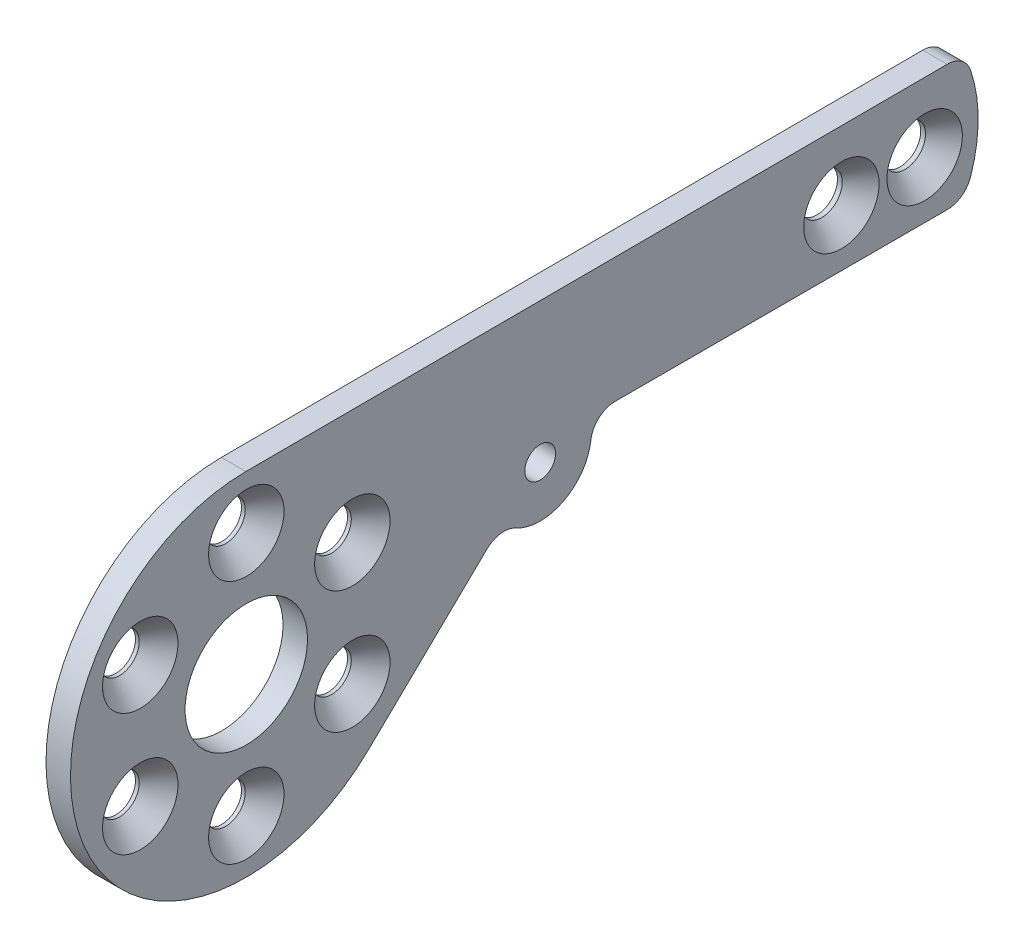
ISO-10303-21;
HEADER;
FILE_DESCRIPTION(('STEP AP214'),'2;1');
FILE_NAME('part.step','',(''),(''),'','','');
FILE_SCHEMA(('AUTOMOTIVE_DESIGN { 1 0 10303 214 1 1 1 1 }'));
ENDSEC;
DATA;
#1=APPLICATION_CONTEXT('core data for automotive mechanical design processes');
#2=APPLICATION_PROTOCOL_DEFINITION('international standard','automotive_design',2000,#1);
#3=PRODUCT_CONTEXT('',#1,'mechanical');
#4=PRODUCT('Part','Part','',(#3));
#5=PRODUCT_RELATED_PRODUCT_CATEGORY('part','',(#4));
#6=PRODUCT_DEFINITION_FORMATION('','',#4);
#7=PRODUCT_DEFINITION_CONTEXT('part definition',#1,'design');
#8=PRODUCT_DEFINITION('design','',#6,#7);
#9=PRODUCT_DEFINITION_SHAPE('','',#8);
#10=(LENGTH_UNIT() NAMED_UNIT(*) SI_UNIT(.MILLI.,.METRE.));
#11=(NAMED_UNIT(*) PLANE_ANGLE_UNIT() SI_UNIT($,.RADIAN.));
#12=(NAMED_UNIT(*) SI_UNIT($,.STERADIAN.) SOLID_ANGLE_UNIT());
#13=UNCERTAINTY_MEASURE_WITH_UNIT(LENGTH_MEASURE(1.E-05),#10,'distance_accuracy_value','');
#14=(GEOMETRIC_REPRESENTATION_CONTEXT(3) GLOBAL_UNCERTAINTY_ASSIGNED_CONTEXT((#13)) GLOBAL_UNIT_ASSIGNED_CONTEXT((#10,
#11,#12)) REPRESENTATION_CONTEXT('',''));
#15=CARTESIAN_POINT('',(0.,0.,0.));
#16=DIRECTION('',(0.,0.,1.));
#17=DIRECTION('',(1.,0.,0.));
#18=AXIS2_PLACEMENT_3D('',#15,#16,#17);
#19=CARTESIAN_POINT('',(-2.74319999999998,14.8974267729546,-76.2137486896777));
#20=DIRECTION('',(1.,0.,0.));
#21=DIRECTION('',(0.,0.,-1.));
#22=AXIS2_PLACEMENT_3D('',#19,#20,#21);
#23=PLANE('',#22);
#24=CARTESIAN_POINT('',(-2.74319999999998,7.93749999999997,-13.748153285078));
#25=DIRECTION('',(1.,0.,0.));
#26=DIRECTION('',(0.,0.,-1.));
#27=AXIS2_PLACEMENT_3D('',#24,#25,#26);
#28=CIRCLE('',#27,2.5527);
#29=CARTESIAN_POINT('',(-2.74319999999998,7.93749999999997,-16.300853285078));
#30=VERTEX_POINT('',#29);
#31=EDGE_CURVE('E367',#30,#30,#28,.T.);
#32=ORIENTED_EDGE('',*,*,#31,.T.);
#33=EDGE_LOOP('',(#32));
#34=FACE_BOUND('',#33,.T.);
#35=CARTESIAN_POINT('',(-2.74319999999998,15.875,0.));
#36=DIRECTION('',(1.,0.,0.));
#37=DIRECTION('',(0.,0.,-1.));
#38=AXIS2_PLACEMENT_3D('',#35,#36,#37);
#39=CIRCLE('',#38,2.5527);
#40=CARTESIAN_POINT('',(-2.74319999999998,15.875,-2.5527));
#41=VERTEX_POINT('',#40);
#42=EDGE_CURVE('E375',#41,#41,#39,.T.);
#43=ORIENTED_EDGE('',*,*,#42,.T.);
#44=EDGE_LOOP('',(#43));
#45=FACE_BOUND('',#44,.T.);
#46=CARTESIAN_POINT('',(-2.74319999999998,7.93750000000016,13.7481532850779));
#47=DIRECTION('',(1.,0.,0.));
#48=DIRECTION('',(0.,0.,-1.));
#49=AXIS2_PLACEMENT_3D('',#46,#47,#48);
#50=CIRCLE('',#49,2.5527);
#51=CARTESIAN_POINT('',(-2.74319999999998,7.93750000000016,11.1954532850779));
#52=VERTEX_POINT('',#51);
#53=EDGE_CURVE('E384',#52,#52,#50,.T.);
#54=ORIENTED_EDGE('',*,*,#53,.T.);
#55=EDGE_LOOP('',(#54));
#56=FACE_BOUND('',#55,.T.);
#57=CARTESIAN_POINT('',(-2.74319999999998,-7.93749999999987,13.748153285078));
#58=DIRECTION('',(1.,0.,0.));
#59=DIRECTION('',(0.,0.,-1.));
#60=AXIS2_PLACEMENT_3D('',#57,#58,#59);
#61=CIRCLE('',#60,2.5527);
#62=CARTESIAN_POINT('',(-2.74319999999998,-7.93749999999987,11.195453285078));
#63=VERTEX_POINT('',#62);
#64=EDGE_CURVE('E393',#63,#63,#61,.T.);
#65=ORIENTED_EDGE('',*,*,#64,.T.);
#66=EDGE_LOOP('',(#65));
#67=FACE_BOUND('',#66,.T.);
#68=CARTESIAN_POINT('',(-2.74319999999998,-15.875,0.));
#69=DIRECTION('',(1.,0.,0.));
#70=DIRECTION('',(0.,0.,-1.));
#71=AXIS2_PLACEMENT_3D('',#68,#69,#70);
#72=CIRCLE('',#71,2.5527);
#73=CARTESIAN_POINT('',(-2.74319999999998,-15.875,-2.5527));
#74=VERTEX_POINT('',#73);
#75=EDGE_CURVE('E402',#74,#74,#72,.T.);
#76=ORIENTED_EDGE('',*,*,#75,.T.);
#77=EDGE_LOOP('',(#76));
#78=FACE_BOUND('',#77,.T.);
#79=CARTESIAN_POINT('',(-2.74319999999998,-7.93750000000007,-13.7481532850779));
#80=DIRECTION('',(1.,0.,0.));
#81=DIRECTION('',(0.,0.,-1.));
#82=AXIS2_PLACEMENT_3D('',#79,#80,#81);
#83=CIRCLE('',#82,2.5527);
#84=CARTESIAN_POINT('',(-2.74319999999998,-7.93750000000007,-16.3008532850779));
#85=VERTEX_POINT('',#84);
#86=EDGE_CURVE('E149',#85,#85,#83,.T.);
#87=ORIENTED_EDGE('',*,*,#86,.T.);
#88=EDGE_LOOP('',(#87));
#89=FACE_BOUND('',#88,.T.);
#90=CARTESIAN_POINT('',(-2.74319999999998,0.,0.));
#91=DIRECTION('',(1.,0.,0.));
#92=DIRECTION('',(0.,0.,-1.));
#93=AXIS2_PLACEMENT_3D('',#90,#91,#92);
#94=CIRCLE('',#93,7.9375);
#95=CARTESIAN_POINT('',(-2.74319999999998,0.,-7.9375));
#96=VERTEX_POINT('',#95);
#97=EDGE_CURVE('E183',#96,#96,#94,.T.);
#98=ORIENTED_EDGE('',*,*,#97,.T.);
#99=EDGE_LOOP('',(#98));
#100=FACE_BOUND('',#99,.T.);
#101=CARTESIAN_POINT('',(-2.74319999999998,14.088357975241,-87.9475));
#102=DIRECTION('',(-1.,0.,0.));
#103=DIRECTION('',(0.,0.,1.));
#104=AXIS2_PLACEMENT_3D('',#101,#102,#103);
#105=CIRCLE('',#104,2.667);
#106=CARTESIAN_POINT('',(-2.74319999999998,14.088357975241,-85.2805));
#107=VERTEX_POINT('',#106);
#108=EDGE_CURVE('E176',#107,#107,#105,.T.);
#109=ORIENTED_EDGE('',*,*,#108,.F.);
#110=EDGE_LOOP('',(#109));
#111=FACE_BOUND('',#110,.T.);
#112=CARTESIAN_POINT('',(-2.74319999999998,14.088357975241,-77.1525));
#113=DIRECTION('',(-1.,0.,0.));
#114=DIRECTION('',(0.,0.,1.));
#115=AXIS2_PLACEMENT_3D('',#112,#113,#114);
#116=CIRCLE('',#115,2.667);
#117=CARTESIAN_POINT('',(-2.74319999999998,14.088357975241,-74.4855));
#118=VERTEX_POINT('',#117);
#119=EDGE_CURVE('E177',#118,#118,#116,.T.);
#120=ORIENTED_EDGE('',*,*,#119,.F.);
#121=EDGE_LOOP('',(#120));
#122=FACE_BOUND('',#121,.T.);
#123=CARTESIAN_POINT('',(-2.74319999999998,4.7625,-38.1));
#124=DIRECTION('',(1.,0.,0.));
#125=DIRECTION('',(0.,0.,-1.));
#126=AXIS2_PLACEMENT_3D('',#123,#124,#125);
#127=CIRCLE('',#126,2.);
#128=CARTESIAN_POINT('',(-2.74319999999998,4.7625,-40.1));
#129=VERTEX_POINT('',#128);
#130=EDGE_CURVE('E173',#129,#129,#127,.T.);
#131=ORIENTED_EDGE('',*,*,#130,.T.);
#132=EDGE_LOOP('',(#131));
#133=FACE_BOUND('',#132,.T.);
#134=DIRECTION('',(0.,0.00286638113914542,-0.999995891921145));
#135=VECTOR('',#134,1.);
#136=CARTESIAN_POINT('',(-2.74319999999998,22.7964063501804,0.065343457638542));
#137=LINE('',#136,#135);
#138=CARTESIAN_POINT('',(-2.74319999999998,22.7964063501804,0.065343457638542));
#139=VERTEX_POINT('',#138);
#140=CARTESIAN_POINT('',(-2.74319999999998,23.0570769049798,-90.8749297615521));
#141=VERTEX_POINT('',#140);
#142=EDGE_CURVE('E159',#139,#141,#137,.T.);
#143=ORIENTED_EDGE('',*,*,#142,.T.);
#144=CARTESIAN_POINT('',(-2.74319999999998,19.8820899481302,-90.8840305216688));
#145=DIRECTION('',(1.,0.,0.));
#146=DIRECTION('',(0.,0.,-1.));
#147=AXIS2_PLACEMENT_3D('',#144,#145,#146);
#148=CIRCLE('',#147,3.175);
#149=CARTESIAN_POINT('',(-2.74319999999998,20.9035373200924,-93.8902358151097));
#150=VERTEX_POINT('',#149);
#151=EDGE_CURVE('E204',#141,#150,#148,.F.);
#152=ORIENTED_EDGE('',*,*,#151,.T.);
#153=CARTESIAN_POINT('',(-2.74319999999998,14.8974267729546,-76.2137486896777));
#154=DIRECTION('',(-1.,0.,0.));
#155=DIRECTION('',(0.,0.,1.));
#156=AXIS2_PLACEMENT_3D('',#153,#154,#155);
#157=CIRCLE('',#156,18.669);
#158=CARTESIAN_POINT('',(-2.74319999999998,8.88316664488635,-93.887464657519));
#159=VERTEX_POINT('',#158);
#160=EDGE_CURVE('E162',#150,#159,#157,.T.);
#161=ORIENTED_EDGE('',*,*,#160,.T.);
#162=CARTESIAN_POINT('',(-2.74319999999998,9.906,-90.8817306493827));
#163=DIRECTION('',(1.,0.,0.));
#164=DIRECTION('',(0.,0.,-1.));
#165=AXIS2_PLACEMENT_3D('',#162,#163,#164);
#166=CIRCLE('',#165,3.175);
#167=CARTESIAN_POINT('',(-2.74319999999998,6.731,-90.8817306493827));
#168=VERTEX_POINT('',#167);
#169=EDGE_CURVE('E202',#159,#168,#166,.F.);
#170=ORIENTED_EDGE('',*,*,#169,.T.);
#171=DIRECTION('',(0.,0.,1.));
#172=VECTOR('',#171,1.);
#173=CARTESIAN_POINT('',(-2.74319999999998,6.731,-93.0018705251294));
#174=LINE('',#173,#172);
#175=CARTESIAN_POINT('',(-2.74319999999998,6.731,-47.8194029523423));
#176=VERTEX_POINT('',#175);
#177=EDGE_CURVE('E165',#168,#176,#174,.T.);
#178=ORIENTED_EDGE('',*,*,#177,.T.);
#179=CARTESIAN_POINT('',(-2.74319999999998,3.556,-47.8194029523423));
#180=DIRECTION('',(1.,0.,0.));
#181=DIRECTION('',(0.,0.,-1.));
#182=AXIS2_PLACEMENT_3D('',#179,#180,#181);
#183=CIRCLE('',#182,3.175);
#184=CARTESIAN_POINT('',(-2.74319999999998,3.94712083928936,-44.6685856791458));
#185=VERTEX_POINT('',#184);
#186=EDGE_CURVE('E47',#176,#185,#183,.T.);
#187=ORIENTED_EDGE('',*,*,#186,.T.);
#188=CARTESIAN_POINT('',(-2.74319999999998,4.7625,-38.1));
#189=DIRECTION('',(-1.,0.,0.));
#190=DIRECTION('',(0.,0.,1.));
#191=AXIS2_PLACEMENT_3D('',#188,#189,#190);
#192=CIRCLE('',#191,6.619);
#193=CARTESIAN_POINT('',(-2.74319999999998,-1.04458247657096,-34.9236885999162));
#194=VERTEX_POINT('',#193);
#195=EDGE_CURVE('E146',#185,#194,#192,.T.);
#196=ORIENTED_EDGE('',*,*,#195,.T.);
#197=CARTESIAN_POINT('',(-2.74319999999998,-3.8301221144487,-33.4000764688894));
#198=DIRECTION('',(1.,0.,0.));
#199=DIRECTION('',(0.,0.,-1.));
#200=AXIS2_PLACEMENT_3D('',#197,#198,#199);
#201=CIRCLE('',#200,3.175);
#202=CARTESIAN_POINT('',(-2.74319999999998,-1.5477366962061,-31.1929648263589));
#203=VERTEX_POINT('',#202);
#204=EDGE_CURVE('E213',#194,#203,#201,.T.);
#205=ORIENTED_EDGE('',*,*,#204,.T.);
#206=DIRECTION('',(0.,-0.695153273237943,0.718861549052788));
#207=VECTOR('',#206,1.);
#208=CARTESIAN_POINT('',(-2.74319999999998,0.355663257577406,-33.1612804366279));
#209=LINE('',#208,#207);
#210=CARTESIAN_POINT('',(-2.74319999999998,-16.3875273029819,-15.8470615933688));
#211=VERTEX_POINT('',#210);
#212=EDGE_CURVE('E142',#203,#211,#209,.T.);
#213=ORIENTED_EDGE('',*,*,#212,.T.);
#214=CARTESIAN_POINT('',(-2.74319999999998,0.,0.));
#215=DIRECTION('',(-1.,0.,0.));
#216=DIRECTION('',(0.,0.,1.));
#217=AXIS2_PLACEMENT_3D('',#214,#215,#216);
#218=CIRCLE('',#217,22.7965);
#219=EDGE_CURVE('E135',#211,#139,#218,.T.);
#220=ORIENTED_EDGE('',*,*,#219,.T.);
#221=EDGE_LOOP('',(#143,#152,#161,#170,#178,#187,#196,#205,#213,#220));
#222=FACE_BOUND('',#221,.T.);
#223=ADVANCED_FACE('F39',(#34,#45,#56,#67,#78,#89,#100,#111,#122,#133,#222),#23,.F.);
#224=CARTESIAN_POINT('',(0.431800000000019,14.8974267729546,-76.2137486896777));
#225=DIRECTION('',(1.,0.,0.));
#226=DIRECTION('',(0.,0.,-1.));
#227=AXIS2_PLACEMENT_3D('',#224,#225,#226);
#228=PLANE('',#227);
#229=CARTESIAN_POINT('',(0.43180000000002,14.088357975241,-87.9475));
#230=DIRECTION('',(1.,0.,0.));
#231=DIRECTION('',(0.,0.,-1.));
#232=AXIS2_PLACEMENT_3D('',#229,#230,#231);
#233=CIRCLE('',#232,4.8895);
#234=CARTESIAN_POINT('',(0.43180000000002,14.088357975241,-92.837));
#235=VERTEX_POINT('',#234);
#236=EDGE_CURVE('E348',#235,#235,#233,.T.);
#237=ORIENTED_EDGE('',*,*,#236,.F.);
#238=EDGE_LOOP('',(#237));
#239=FACE_BOUND('',#238,.T.);
#240=CARTESIAN_POINT('',(0.43180000000002,14.088357975241,-77.1525));
#241=DIRECTION('',(1.,0.,0.));
#242=DIRECTION('',(0.,0.,-1.));
#243=AXIS2_PLACEMENT_3D('',#240,#241,#242);
#244=CIRCLE('',#243,4.8895);
#245=CARTESIAN_POINT('',(0.43180000000002,14.088357975241,-82.042));
#246=VERTEX_POINT('',#245);
#247=EDGE_CURVE('E352',#246,#246,#244,.T.);
#248=ORIENTED_EDGE('',*,*,#247,.F.);
#249=EDGE_LOOP('',(#248));
#250=FACE_BOUND('',#249,.T.);
#251=CARTESIAN_POINT('',(0.43180000000002,7.93749999999997,-13.748153285078));
#252=DIRECTION('',(1.,0.,0.));
#253=DIRECTION('',(0.,0.,-1.));
#254=AXIS2_PLACEMENT_3D('',#251,#252,#253);
#255=CIRCLE('',#254,4.8895);
#256=CARTESIAN_POINT('',(0.43180000000002,7.93749999999997,-18.637653285078));
#257=VERTEX_POINT('',#256);
#258=EDGE_CURVE('E361',#257,#257,#255,.T.);
#259=ORIENTED_EDGE('',*,*,#258,.F.);
#260=EDGE_LOOP('',(#259));
#261=FACE_BOUND('',#260,.T.);
#262=CARTESIAN_POINT('',(0.43180000000002,15.875,0.));
#263=DIRECTION('',(1.,0.,0.));
#264=DIRECTION('',(0.,0.,-1.));
#265=AXIS2_PLACEMENT_3D('',#262,#263,#264);
#266=CIRCLE('',#265,4.8895);
#267=CARTESIAN_POINT('',(0.43180000000002,15.875,-4.8895));
#268=VERTEX_POINT('',#267);
#269=EDGE_CURVE('E369',#268,#268,#266,.T.);
#270=ORIENTED_EDGE('',*,*,#269,.F.);
#271=EDGE_LOOP('',(#270));
#272=FACE_BOUND('',#271,.T.);
#273=CARTESIAN_POINT('',(0.43180000000002,7.93750000000016,13.7481532850779));
#274=DIRECTION('',(1.,0.,0.));
#275=DIRECTION('',(0.,0.,-1.));
#276=AXIS2_PLACEMENT_3D('',#273,#274,#275);
#277=CIRCLE('',#276,4.8895);
#278=CARTESIAN_POINT('',(0.43180000000002,7.93750000000016,8.85865328507787));
#279=VERTEX_POINT('',#278);
#280=EDGE_CURVE('E378',#279,#279,#277,.T.);
#281=ORIENTED_EDGE('',*,*,#280,.F.);
#282=EDGE_LOOP('',(#281));
#283=FACE_BOUND('',#282,.T.);
#284=CARTESIAN_POINT('',(0.43180000000002,-7.93749999999987,13.748153285078));
#285=DIRECTION('',(1.,0.,0.));
#286=DIRECTION('',(0.,0.,-1.));
#287=AXIS2_PLACEMENT_3D('',#284,#285,#286);
#288=CIRCLE('',#287,4.8895);
#289=CARTESIAN_POINT('',(0.43180000000002,-7.93749999999987,8.85865328507804));
#290=VERTEX_POINT('',#289);
#291=EDGE_CURVE('E387',#290,#290,#288,.T.);
#292=ORIENTED_EDGE('',*,*,#291,.F.);
#293=EDGE_LOOP('',(#292));
#294=FACE_BOUND('',#293,.T.);
#295=CARTESIAN_POINT('',(0.43180000000002,-15.875,0.));
#296=DIRECTION('',(1.,0.,0.));
#297=DIRECTION('',(0.,0.,-1.));
#298=AXIS2_PLACEMENT_3D('',#295,#296,#297);
#299=CIRCLE('',#298,4.8895);
#300=CARTESIAN_POINT('',(0.43180000000002,-15.875,-4.8895));
#301=VERTEX_POINT('',#300);
#302=EDGE_CURVE('E396',#301,#301,#299,.T.);
#303=ORIENTED_EDGE('',*,*,#302,.F.);
#304=EDGE_LOOP('',(#303));
#305=FACE_BOUND('',#304,.T.);
#306=CARTESIAN_POINT('',(0.43180000000002,-7.93750000000007,-13.7481532850779));
#307=DIRECTION('',(1.,0.,0.));
#308=DIRECTION('',(0.,0.,-1.));
#309=AXIS2_PLACEMENT_3D('',#306,#307,#308);
#310=CIRCLE('',#309,4.8895);
#311=CARTESIAN_POINT('',(0.43180000000002,-7.93750000000007,-18.6376532850779));
#312=VERTEX_POINT('',#311);
#313=EDGE_CURVE('E405',#312,#312,#310,.T.);
#314=ORIENTED_EDGE('',*,*,#313,.F.);
#315=EDGE_LOOP('',(#314));
#316=FACE_BOUND('',#315,.T.);
#317=CARTESIAN_POINT('',(0.431800000000019,0.,0.));
#318=DIRECTION('',(1.,0.,0.));
#319=DIRECTION('',(0.,0.,-1.));
#320=AXIS2_PLACEMENT_3D('',#317,#318,#319);
#321=CIRCLE('',#320,7.9375);
#322=CARTESIAN_POINT('',(0.431800000000019,0.,-7.9375));
#323=VERTEX_POINT('',#322);
#324=EDGE_CURVE('E180',#323,#323,#321,.T.);
#325=ORIENTED_EDGE('',*,*,#324,.F.);
#326=EDGE_LOOP('',(#325));
#327=FACE_BOUND('',#326,.T.);
#328=CARTESIAN_POINT('',(0.431800000000019,4.7625,-38.1));
#329=DIRECTION('',(1.,0.,0.));
#330=DIRECTION('',(0.,0.,-1.));
#331=AXIS2_PLACEMENT_3D('',#328,#329,#330);
#332=CIRCLE('',#331,2.);
#333=CARTESIAN_POINT('',(0.431800000000019,4.7625,-40.1));
#334=VERTEX_POINT('',#333);
#335=EDGE_CURVE('E136',#334,#334,#332,.T.);
#336=ORIENTED_EDGE('',*,*,#335,.F.);
#337=EDGE_LOOP('',(#336));
#338=FACE_BOUND('',#337,.T.);
#339=CARTESIAN_POINT('',(0.431800000000019,14.8974267729546,-76.2137486896777));
#340=DIRECTION('',(-1.,0.,0.));
#341=DIRECTION('',(0.,0.,1.));
#342=AXIS2_PLACEMENT_3D('',#339,#340,#341);
#343=CIRCLE('',#342,18.669);
#344=CARTESIAN_POINT('',(0.431800000000019,20.9035373200924,-93.8902358151097));
#345=VERTEX_POINT('',#344);
#346=CARTESIAN_POINT('',(0.431800000000019,8.88316664488635,-93.887464657519));
#347=VERTEX_POINT('',#346);
#348=EDGE_CURVE('E144',#345,#347,#343,.T.);
#349=ORIENTED_EDGE('',*,*,#348,.F.);
#350=CARTESIAN_POINT('',(0.431800000000019,19.8820899481302,-90.8840305216688));
#351=DIRECTION('',(1.,0.,0.));
#352=DIRECTION('',(0.,0.,-1.));
#353=AXIS2_PLACEMENT_3D('',#350,#351,#352);
#354=CIRCLE('',#353,3.175);
#355=CARTESIAN_POINT('',(0.431800000000019,23.0570769049798,-90.8749297615521));
#356=VERTEX_POINT('',#355);
#357=EDGE_CURVE('E211',#345,#356,#354,.T.);
#358=ORIENTED_EDGE('',*,*,#357,.T.);
#359=DIRECTION('',(0.,0.00286638113914542,-0.999995891921145));
#360=VECTOR('',#359,1.);
#361=CARTESIAN_POINT('',(0.431800000000019,22.7964063501804,0.065343457638542));
#362=LINE('',#361,#360);
#363=CARTESIAN_POINT('',(0.431800000000019,22.7964063501804,0.0653434576385337));
#364=VERTEX_POINT('',#363);
#365=EDGE_CURVE('E141',#364,#356,#362,.T.);
#366=ORIENTED_EDGE('',*,*,#365,.F.);
#367=CARTESIAN_POINT('',(0.431800000000019,0.,0.));
#368=DIRECTION('',(-1.,0.,0.));
#369=DIRECTION('',(0.,0.,1.));
#370=AXIS2_PLACEMENT_3D('',#367,#368,#369);
#371=CIRCLE('',#370,22.7965);
#372=CARTESIAN_POINT('',(0.431800000000019,-16.3875273029819,-15.8470615933688));
#373=VERTEX_POINT('',#372);
#374=EDGE_CURVE('E132',#373,#364,#371,.T.);
#375=ORIENTED_EDGE('',*,*,#374,.F.);
#376=DIRECTION('',(0.,-0.695153273237943,0.718861549052788));
#377=VECTOR('',#376,1.);
#378=CARTESIAN_POINT('',(0.431800000000019,0.355663257577406,-33.1612804366279));
#379=LINE('',#378,#377);
#380=CARTESIAN_POINT('',(0.431800000000019,-1.5477366962061,-31.1929648263589));
#381=VERTEX_POINT('',#380);
#382=EDGE_CURVE('E117',#381,#373,#379,.T.);
#383=ORIENTED_EDGE('',*,*,#382,.F.);
#384=CARTESIAN_POINT('',(0.431800000000019,-3.8301221144487,-33.4000764688894));
#385=DIRECTION('',(1.,0.,0.));
#386=DIRECTION('',(0.,0.,-1.));
#387=AXIS2_PLACEMENT_3D('',#384,#385,#386);
#388=CIRCLE('',#387,3.175);
#389=CARTESIAN_POINT('',(0.431800000000019,-1.04458247657096,-34.9236885999162));
#390=VERTEX_POINT('',#389);
#391=EDGE_CURVE('E215',#381,#390,#388,.F.);
#392=ORIENTED_EDGE('',*,*,#391,.T.);
#393=CARTESIAN_POINT('',(0.431800000000019,4.7625,-38.1));
#394=DIRECTION('',(-1.,0.,0.));
#395=DIRECTION('',(0.,0.,1.));
#396=AXIS2_PLACEMENT_3D('',#393,#394,#395);
#397=CIRCLE('',#396,6.619);
#398=CARTESIAN_POINT('',(0.431800000000019,3.94712083928936,-44.6685856791458));
#399=VERTEX_POINT('',#398);
#400=EDGE_CURVE('E128',#399,#390,#397,.T.);
#401=ORIENTED_EDGE('',*,*,#400,.F.);
#402=CARTESIAN_POINT('',(0.431800000000019,3.556,-47.8194029523423));
#403=DIRECTION('',(1.,0.,0.));
#404=DIRECTION('',(0.,0.,-1.));
#405=AXIS2_PLACEMENT_3D('',#402,#403,#404);
#406=CIRCLE('',#405,3.175);
#407=CARTESIAN_POINT('',(0.431800000000019,6.731,-47.8194029523423));
#408=VERTEX_POINT('',#407);
#409=EDGE_CURVE('E11',#399,#408,#406,.F.);
#410=ORIENTED_EDGE('',*,*,#409,.T.);
#411=DIRECTION('',(0.,0.,1.));
#412=VECTOR('',#411,1.);
#413=CARTESIAN_POINT('',(0.431800000000019,6.731,-93.0018705251294));
#414=LINE('',#413,#412);
#415=CARTESIAN_POINT('',(0.431800000000019,6.731,-90.8817306493827));
#416=VERTEX_POINT('',#415);
#417=EDGE_CURVE('E153',#416,#408,#414,.T.);
#418=ORIENTED_EDGE('',*,*,#417,.F.);
#419=CARTESIAN_POINT('',(0.431800000000019,9.906,-90.8817306493827));
#420=DIRECTION('',(1.,0.,0.));
#421=DIRECTION('',(0.,0.,-1.));
#422=AXIS2_PLACEMENT_3D('',#419,#420,#421);
#423=CIRCLE('',#422,3.175);
#424=EDGE_CURVE('E54',#416,#347,#423,.T.);
#425=ORIENTED_EDGE('',*,*,#424,.T.);
#426=EDGE_LOOP('',(#349,#358,#366,#375,#383,#392,#401,#410,#418,#425));
#427=FACE_BOUND('',#426,.T.);
#428=ADVANCED_FACE('F139',(#239,#250,#261,#272,#283,#294,#305,#316,#327,#338,#427),#228,.T.);
#429=CARTESIAN_POINT('',(-2.74319999999998,0.,0.));
#430=DIRECTION('',(1.,0.,0.));
#431=DIRECTION('',(0.,0.,-1.));
#432=AXIS2_PLACEMENT_3D('',#429,#430,#431);
#433=CYLINDRICAL_SURFACE('',#432,7.9375);
#434=ORIENTED_EDGE('',*,*,#97,.F.);
#435=EDGE_LOOP('',(#434));
#436=FACE_BOUND('',#435,.T.);
#437=ORIENTED_EDGE('',*,*,#324,.T.);
#438=EDGE_LOOP('',(#437));
#439=FACE_BOUND('',#438,.T.);
#440=ADVANCED_FACE('F258',(#436,#439),#433,.F.);
#441=CARTESIAN_POINT('',(40.1193,14.088357975241,-87.9475));
#442=DIRECTION('',(-1.,0.,0.));
#443=DIRECTION('',(0.,0.,1.));
#444=AXIS2_PLACEMENT_3D('',#441,#442,#443);
#445=CYLINDRICAL_SURFACE('',#444,2.667);
#446=CARTESIAN_POINT('',(-2.12489378504866,14.088357975241,-87.9475));
#447=DIRECTION('',(1.,0.,0.));
#448=DIRECTION('',(0.,0.,-1.));
#449=AXIS2_PLACEMENT_3D('',#446,#447,#448);
#450=CIRCLE('',#449,2.667);
#451=CARTESIAN_POINT('',(-2.12489378504866,14.088357975241,-90.6145));
#452=VERTEX_POINT('',#451);
#453=EDGE_CURVE('E351',#452,#452,#450,.T.);
#454=ORIENTED_EDGE('',*,*,#453,.T.);
#455=EDGE_LOOP('',(#454));
#456=FACE_BOUND('',#455,.T.);
#457=ORIENTED_EDGE('',*,*,#108,.T.);
#458=EDGE_LOOP('',(#457));
#459=FACE_BOUND('',#458,.T.);
#460=ADVANCED_FACE('F265',(#456,#459),#445,.F.);
#461=CARTESIAN_POINT('',(40.1193,14.088357975241,-77.1525));
#462=DIRECTION('',(-1.,0.,0.));
#463=DIRECTION('',(0.,0.,1.));
#464=AXIS2_PLACEMENT_3D('',#461,#462,#463);
#465=CYLINDRICAL_SURFACE('',#464,2.667);
#466=CARTESIAN_POINT('',(-2.12489378504866,14.088357975241,-77.1525));
#467=DIRECTION('',(1.,0.,0.));
#468=DIRECTION('',(0.,0.,-1.));
#469=AXIS2_PLACEMENT_3D('',#466,#467,#468);
#470=CIRCLE('',#469,2.667);
#471=CARTESIAN_POINT('',(-2.12489378504866,14.088357975241,-79.8195));
#472=VERTEX_POINT('',#471);
#473=EDGE_CURVE('E355',#472,#472,#470,.T.);
#474=ORIENTED_EDGE('',*,*,#473,.T.);
#475=EDGE_LOOP('',(#474));
#476=FACE_BOUND('',#475,.T.);
#477=ORIENTED_EDGE('',*,*,#119,.T.);
#478=EDGE_LOOP('',(#477));
#479=FACE_BOUND('',#478,.T.);
#480=ADVANCED_FACE('F269',(#476,#479),#465,.F.);
#481=CARTESIAN_POINT('',(-33.8582,4.7625,-38.1));
#482=DIRECTION('',(1.,0.,0.));
#483=DIRECTION('',(0.,0.,-1.));
#484=AXIS2_PLACEMENT_3D('',#481,#482,#483);
#485=CYLINDRICAL_SURFACE('',#484,2.);
#486=ORIENTED_EDGE('',*,*,#335,.T.);
#487=EDGE_LOOP('',(#486));
#488=FACE_BOUND('',#487,.T.);
#489=ORIENTED_EDGE('',*,*,#130,.F.);
#490=EDGE_LOOP('',(#489));
#491=FACE_BOUND('',#490,.T.);
#492=ADVANCED_FACE('F273',(#488,#491),#485,.F.);
#493=CARTESIAN_POINT('',(0.431800000000019,0.,0.));
#494=DIRECTION('',(-1.,0.,0.));
#495=DIRECTION('',(0.,0.,1.));
#496=AXIS2_PLACEMENT_3D('',#493,#494,#495);
#497=CYLINDRICAL_SURFACE('',#496,22.7965);
#498=ORIENTED_EDGE('',*,*,#219,.F.);
#499=DIRECTION('',(-1.,0.,0.));
#500=VECTOR('',#499,1.);
#501=CARTESIAN_POINT('',(0.431800000000019,-16.3875273029819,-15.8470615933688));
#502=LINE('',#501,#500);
#503=EDGE_CURVE('E121',#373,#211,#502,.T.);
#504=ORIENTED_EDGE('',*,*,#503,.F.);
#505=ORIENTED_EDGE('',*,*,#374,.T.);
#506=DIRECTION('',(-1.,0.,0.));
#507=VECTOR('',#506,1.);
#508=CARTESIAN_POINT('',(0.431800000000019,22.7964063501804,0.065343457638542));
#509=LINE('',#508,#507);
#510=EDGE_CURVE('E127',#364,#139,#509,.T.);
#511=ORIENTED_EDGE('',*,*,#510,.T.);
#512=EDGE_LOOP('',(#498,#504,#505,#511));
#513=FACE_BOUND('',#512,.T.);
#514=ADVANCED_FACE('F131',(#513),#497,.T.);
#515=CARTESIAN_POINT('',(0.431800000000019,0.355663257577406,-33.1612804366279));
#516=DIRECTION('',(0.,-0.718861549052788,-0.695153273237943));
#517=DIRECTION('',(0.,0.695153273237943,-0.718861549052788));
#518=AXIS2_PLACEMENT_3D('',#515,#516,#517);
#519=PLANE('',#518);
#520=ORIENTED_EDGE('',*,*,#212,.F.);
#521=DIRECTION('',(1.,0.,0.));
#522=VECTOR('',#521,1.);
#523=CARTESIAN_POINT('',(0.431800000000019,-1.5477366962061,-31.1929648263589));
#524=LINE('',#523,#522);
#525=EDGE_CURVE('E124',#203,#381,#524,.T.);
#526=ORIENTED_EDGE('',*,*,#525,.T.);
#527=ORIENTED_EDGE('',*,*,#382,.T.);
#528=ORIENTED_EDGE('',*,*,#503,.T.);
#529=EDGE_LOOP('',(#520,#526,#527,#528));
#530=FACE_BOUND('',#529,.T.);
#531=ADVANCED_FACE('F120',(#530),#519,.T.);
#532=CARTESIAN_POINT('',(0.431800000000019,4.7625,-38.1));
#533=DIRECTION('',(-1.,0.,0.));
#534=DIRECTION('',(0.,0.,1.));
#535=AXIS2_PLACEMENT_3D('',#532,#533,#534);
#536=CYLINDRICAL_SURFACE('',#535,6.619);
#537=ORIENTED_EDGE('',*,*,#400,.T.);
#538=DIRECTION('',(-1.,0.,0.));
#539=VECTOR('',#538,1.);
#540=CARTESIAN_POINT('',(0.431800000000019,-1.04458247657096,-34.9236885999162));
#541=LINE('',#540,#539);
#542=EDGE_CURVE('E190',#390,#194,#541,.T.);
#543=ORIENTED_EDGE('',*,*,#542,.T.);
#544=ORIENTED_EDGE('',*,*,#195,.F.);
#545=DIRECTION('',(-1.,0.,0.));
#546=VECTOR('',#545,1.);
#547=CARTESIAN_POINT('',(0.431800000000019,3.94712083928936,-44.6685856791458));
#548=LINE('',#547,#546);
#549=EDGE_CURVE('E186',#185,#399,#548,.F.);
#550=ORIENTED_EDGE('',*,*,#549,.T.);
#551=EDGE_LOOP('',(#537,#543,#544,#550));
#552=FACE_BOUND('',#551,.T.);
#553=ADVANCED_FACE('F223',(#552),#536,.T.);
#554=CARTESIAN_POINT('',(0.431800000000019,6.731,-93.0018705251294));
#555=DIRECTION('',(0.,-1.,0.));
#556=DIRECTION('',(0.,0.,-1.));
#557=AXIS2_PLACEMENT_3D('',#554,#555,#556);
#558=PLANE('',#557);
#559=ORIENTED_EDGE('',*,*,#417,.T.);
#560=DIRECTION('',(1.,0.,0.));
#561=VECTOR('',#560,1.);
#562=CARTESIAN_POINT('',(-2.74319999999998,6.731,-47.8194029523423));
#563=LINE('',#562,#561);
#564=EDGE_CURVE('E196',#408,#176,#563,.F.);
#565=ORIENTED_EDGE('',*,*,#564,.T.);
#566=ORIENTED_EDGE('',*,*,#177,.F.);
#567=DIRECTION('',(-1.,0.,0.));
#568=VECTOR('',#567,1.);
#569=CARTESIAN_POINT('',(0.431800000000019,6.731,-90.8817306493827));
#570=LINE('',#569,#568);
#571=EDGE_CURVE('E194',#168,#416,#570,.F.);
#572=ORIENTED_EDGE('',*,*,#571,.T.);
#573=EDGE_LOOP('',(#559,#565,#566,#572));
#574=FACE_BOUND('',#573,.T.);
#575=ADVANCED_FACE('F229',(#574),#558,.T.);
#576=CARTESIAN_POINT('',(0.431800000000019,14.8974267729546,-76.2137486896777));
#577=DIRECTION('',(-1.,0.,0.));
#578=DIRECTION('',(0.,0.,1.));
#579=AXIS2_PLACEMENT_3D('',#576,#577,#578);
#580=CYLINDRICAL_SURFACE('',#579,18.669);
#581=ORIENTED_EDGE('',*,*,#160,.F.);
#582=DIRECTION('',(-1.,0.,0.));
#583=VECTOR('',#582,1.);
#584=CARTESIAN_POINT('',(0.431800000000019,20.9035373200924,-93.8902358151097));
#585=LINE('',#584,#583);
#586=EDGE_CURVE('E61',#150,#345,#585,.F.);
#587=ORIENTED_EDGE('',*,*,#586,.T.);
#588=ORIENTED_EDGE('',*,*,#348,.T.);
#589=DIRECTION('',(-1.,0.,0.));
#590=VECTOR('',#589,1.);
#591=CARTESIAN_POINT('',(0.431800000000019,8.88316664488635,-93.887464657519));
#592=LINE('',#591,#590);
#593=EDGE_CURVE('E206',#347,#159,#592,.T.);
#594=ORIENTED_EDGE('',*,*,#593,.T.);
#595=EDGE_LOOP('',(#581,#587,#588,#594));
#596=FACE_BOUND('',#595,.T.);
#597=ADVANCED_FACE('F233',(#596),#580,.T.);
#598=CARTESIAN_POINT('',(0.431800000000019,22.7964063501804,0.065343457638542));
#599=DIRECTION('',(0.,0.999995891921144,0.00286638113914542));
#600=DIRECTION('',(0.,-0.00286638113914542,0.999995891921145));
#601=AXIS2_PLACEMENT_3D('',#598,#599,#600);
#602=PLANE('',#601);
#603=ORIENTED_EDGE('',*,*,#365,.T.);
#604=DIRECTION('',(-1.,0.,0.));
#605=VECTOR('',#604,1.);
#606=CARTESIAN_POINT('',(0.431800000000019,23.0570769049798,-90.8749297615521));
#607=LINE('',#606,#605);
#608=EDGE_CURVE('E199',#356,#141,#607,.T.);
#609=ORIENTED_EDGE('',*,*,#608,.T.);
#610=ORIENTED_EDGE('',*,*,#142,.F.);
#611=ORIENTED_EDGE('',*,*,#510,.F.);
#612=EDGE_LOOP('',(#603,#609,#610,#611));
#613=FACE_BOUND('',#612,.T.);
#614=ADVANCED_FACE('F240',(#613),#602,.T.);
#615=CARTESIAN_POINT('',(0.431800000000019,-3.8301221144487,-33.4000764688894));
#616=DIRECTION('',(-1.,0.,0.));
#617=DIRECTION('',(0.,0.,1.));
#618=AXIS2_PLACEMENT_3D('',#615,#616,#617);
#619=CYLINDRICAL_SURFACE('',#618,3.175);
#620=ORIENTED_EDGE('',*,*,#391,.F.);
#621=ORIENTED_EDGE('',*,*,#525,.F.);
#622=ORIENTED_EDGE('',*,*,#204,.F.);
#623=ORIENTED_EDGE('',*,*,#542,.F.);
#624=EDGE_LOOP('',(#620,#621,#622,#623));
#625=FACE_BOUND('',#624,.T.);
#626=ADVANCED_FACE('F242',(#625),#619,.F.);
#627=CARTESIAN_POINT('',(0.431800000000019,3.556,-47.8194029523423));
#628=DIRECTION('',(-1.,0.,0.));
#629=DIRECTION('',(0.,0.,1.));
#630=AXIS2_PLACEMENT_3D('',#627,#628,#629);
#631=CYLINDRICAL_SURFACE('',#630,3.175);
#632=ORIENTED_EDGE('',*,*,#409,.F.);
#633=ORIENTED_EDGE('',*,*,#549,.F.);
#634=ORIENTED_EDGE('',*,*,#186,.F.);
#635=ORIENTED_EDGE('',*,*,#564,.F.);
#636=EDGE_LOOP('',(#632,#633,#634,#635));
#637=FACE_BOUND('',#636,.T.);
#638=ADVANCED_FACE('F227',(#637),#631,.F.);
#639=CARTESIAN_POINT('',(0.431800000000019,19.8820899481302,-90.8840305216688));
#640=DIRECTION('',(-1.,0.,0.));
#641=DIRECTION('',(0.,0.,1.));
#642=AXIS2_PLACEMENT_3D('',#639,#640,#641);
#643=CYLINDRICAL_SURFACE('',#642,3.175);
#644=ORIENTED_EDGE('',*,*,#357,.F.);
#645=ORIENTED_EDGE('',*,*,#586,.F.);
#646=ORIENTED_EDGE('',*,*,#151,.F.);
#647=ORIENTED_EDGE('',*,*,#608,.F.);
#648=EDGE_LOOP('',(#644,#645,#646,#647));
#649=FACE_BOUND('',#648,.T.);
#650=ADVANCED_FACE('F238',(#649),#643,.T.);
#651=CARTESIAN_POINT('',(0.431800000000019,9.906,-90.8817306493827));
#652=DIRECTION('',(-1.,0.,0.));
#653=DIRECTION('',(0.,0.,1.));
#654=AXIS2_PLACEMENT_3D('',#651,#652,#653);
#655=CYLINDRICAL_SURFACE('',#654,3.175);
#656=ORIENTED_EDGE('',*,*,#424,.F.);
#657=ORIENTED_EDGE('',*,*,#571,.F.);
#658=ORIENTED_EDGE('',*,*,#169,.F.);
#659=ORIENTED_EDGE('',*,*,#593,.F.);
#660=EDGE_LOOP('',(#656,#657,#658,#659));
#661=FACE_BOUND('',#660,.T.);
#662=ADVANCED_FACE('F41',(#661),#655,.T.);
#663=CARTESIAN_POINT('',(0.431800000000019,-7.93750000000007,-13.7481532850779));
#664=DIRECTION('',(1.,0.,0.));
#665=DIRECTION('',(0.,0.,-1.));
#666=AXIS2_PLACEMENT_3D('',#663,#664,#665);
#667=CYLINDRICAL_SURFACE('',#666,2.55269999999999);
#668=ORIENTED_EDGE('',*,*,#86,.F.);
#669=EDGE_LOOP('',(#668));
#670=FACE_BOUND('',#669,.T.);
#671=CARTESIAN_POINT('',(-2.25638089399403,-7.93750000000007,-13.7481532850779));
#672=DIRECTION('',(1.,0.,0.));
#673=DIRECTION('',(0.,0.,-1.));
#674=AXIS2_PLACEMENT_3D('',#671,#672,#673);
#675=CIRCLE('',#674,2.55269999999999);
#676=CARTESIAN_POINT('',(-2.25638089399403,-7.93750000000007,-16.3008532850779));
#677=VERTEX_POINT('',#676);
#678=EDGE_CURVE('E407',#677,#677,#675,.T.);
#679=ORIENTED_EDGE('',*,*,#678,.T.);
#680=EDGE_LOOP('',(#679));
#681=FACE_BOUND('',#680,.T.);
#682=ADVANCED_FACE('F288',(#670,#681),#667,.F.);
#683=CARTESIAN_POINT('',(0.43180000000002,-7.93750000000007,-13.7481532850779));
#684=DIRECTION('',(1.,0.,0.));
#685=DIRECTION('',(0.,0.,-1.));
#686=AXIS2_PLACEMENT_3D('',#683,#684,#685);
#687=CONICAL_SURFACE('',#686,4.8895,0.715584993317679);
#688=ORIENTED_EDGE('',*,*,#678,.F.);
#689=EDGE_LOOP('',(#688));
#690=FACE_BOUND('',#689,.T.);
#691=ORIENTED_EDGE('',*,*,#313,.T.);
#692=EDGE_LOOP('',(#691));
#693=FACE_BOUND('',#692,.T.);
#694=ADVANCED_FACE('F291',(#690,#693),#687,.F.);
#695=CARTESIAN_POINT('',(0.431800000000019,-15.875,0.));
#696=DIRECTION('',(1.,0.,0.));
#697=DIRECTION('',(0.,0.,-1.));
#698=AXIS2_PLACEMENT_3D('',#695,#696,#697);
#699=CYLINDRICAL_SURFACE('',#698,2.55269999999999);
#700=ORIENTED_EDGE('',*,*,#75,.F.);
#701=EDGE_LOOP('',(#700));
#702=FACE_BOUND('',#701,.T.);
#703=CARTESIAN_POINT('',(-2.25638089399403,-15.875,0.));
#704=DIRECTION('',(1.,0.,0.));
#705=DIRECTION('',(0.,0.,-1.));
#706=AXIS2_PLACEMENT_3D('',#703,#704,#705);
#707=CIRCLE('',#706,2.55269999999999);
#708=CARTESIAN_POINT('',(-2.25638089399403,-15.875,-2.55269999999999));
#709=VERTEX_POINT('',#708);
#710=EDGE_CURVE('E399',#709,#709,#707,.T.);
#711=ORIENTED_EDGE('',*,*,#710,.T.);
#712=EDGE_LOOP('',(#711));
#713=FACE_BOUND('',#712,.T.);
#714=ADVANCED_FACE('F295',(#702,#713),#699,.F.);
#715=CARTESIAN_POINT('',(0.43180000000002,-15.875,0.));
#716=DIRECTION('',(1.,0.,0.));
#717=DIRECTION('',(0.,0.,-1.));
#718=AXIS2_PLACEMENT_3D('',#715,#716,#717);
#719=CONICAL_SURFACE('',#718,4.8895,0.715584993317679);
#720=ORIENTED_EDGE('',*,*,#710,.F.);
#721=EDGE_LOOP('',(#720));
#722=FACE_BOUND('',#721,.T.);
#723=ORIENTED_EDGE('',*,*,#302,.T.);
#724=EDGE_LOOP('',(#723));
#725=FACE_BOUND('',#724,.T.);
#726=ADVANCED_FACE('F299',(#722,#725),#719,.F.);
#727=CARTESIAN_POINT('',(0.431800000000019,-7.93749999999987,13.748153285078));
#728=DIRECTION('',(1.,0.,0.));
#729=DIRECTION('',(0.,0.,-1.));
#730=AXIS2_PLACEMENT_3D('',#727,#728,#729);
#731=CYLINDRICAL_SURFACE('',#730,2.55269999999999);
#732=ORIENTED_EDGE('',*,*,#64,.F.);
#733=EDGE_LOOP('',(#732));
#734=FACE_BOUND('',#733,.T.);
#735=CARTESIAN_POINT('',(-2.25638089399403,-7.93749999999987,13.748153285078));
#736=DIRECTION('',(1.,0.,0.));
#737=DIRECTION('',(0.,0.,-1.));
#738=AXIS2_PLACEMENT_3D('',#735,#736,#737);
#739=CIRCLE('',#738,2.55269999999999);
#740=CARTESIAN_POINT('',(-2.25638089399403,-7.93749999999987,11.195453285078));
#741=VERTEX_POINT('',#740);
#742=EDGE_CURVE('E390',#741,#741,#739,.T.);
#743=ORIENTED_EDGE('',*,*,#742,.T.);
#744=EDGE_LOOP('',(#743));
#745=FACE_BOUND('',#744,.T.);
#746=ADVANCED_FACE('F303',(#734,#745),#731,.F.);
#747=CARTESIAN_POINT('',(0.43180000000002,-7.93749999999987,13.748153285078));
#748=DIRECTION('',(1.,0.,0.));
#749=DIRECTION('',(0.,0.,-1.));
#750=AXIS2_PLACEMENT_3D('',#747,#748,#749);
#751=CONICAL_SURFACE('',#750,4.8895,0.715584993317679);
#752=ORIENTED_EDGE('',*,*,#742,.F.);
#753=EDGE_LOOP('',(#752));
#754=FACE_BOUND('',#753,.T.);
#755=ORIENTED_EDGE('',*,*,#291,.T.);
#756=EDGE_LOOP('',(#755));
#757=FACE_BOUND('',#756,.T.);
#758=ADVANCED_FACE('F307',(#754,#757),#751,.F.);
#759=CARTESIAN_POINT('',(0.431800000000019,7.93750000000016,13.7481532850779));
#760=DIRECTION('',(1.,0.,0.));
#761=DIRECTION('',(0.,0.,-1.));
#762=AXIS2_PLACEMENT_3D('',#759,#760,#761);
#763=CYLINDRICAL_SURFACE('',#762,2.55269999999999);
#764=ORIENTED_EDGE('',*,*,#53,.F.);
#765=EDGE_LOOP('',(#764));
#766=FACE_BOUND('',#765,.T.);
#767=CARTESIAN_POINT('',(-2.25638089399403,7.93750000000016,13.7481532850779));
#768=DIRECTION('',(1.,0.,0.));
#769=DIRECTION('',(0.,0.,-1.));
#770=AXIS2_PLACEMENT_3D('',#767,#768,#769);
#771=CIRCLE('',#770,2.55269999999999);
#772=CARTESIAN_POINT('',(-2.25638089399403,7.93750000000016,11.1954532850779));
#773=VERTEX_POINT('',#772);
#774=EDGE_CURVE('E381',#773,#773,#771,.T.);
#775=ORIENTED_EDGE('',*,*,#774,.T.);
#776=EDGE_LOOP('',(#775));
#777=FACE_BOUND('',#776,.T.);
#778=ADVANCED_FACE('F311',(#766,#777),#763,.F.);
#779=CARTESIAN_POINT('',(0.43180000000002,7.93750000000016,13.7481532850779));
#780=DIRECTION('',(1.,0.,0.));
#781=DIRECTION('',(0.,0.,-1.));
#782=AXIS2_PLACEMENT_3D('',#779,#780,#781);
#783=CONICAL_SURFACE('',#782,4.8895,0.715584993317679);
#784=ORIENTED_EDGE('',*,*,#774,.F.);
#785=EDGE_LOOP('',(#784));
#786=FACE_BOUND('',#785,.T.);
#787=ORIENTED_EDGE('',*,*,#280,.T.);
#788=EDGE_LOOP('',(#787));
#789=FACE_BOUND('',#788,.T.);
#790=ADVANCED_FACE('F315',(#786,#789),#783,.F.);
#791=CARTESIAN_POINT('',(0.431800000000019,15.875,0.));
#792=DIRECTION('',(1.,0.,0.));
#793=DIRECTION('',(0.,0.,-1.));
#794=AXIS2_PLACEMENT_3D('',#791,#792,#793);
#795=CYLINDRICAL_SURFACE('',#794,2.55269999999999);
#796=ORIENTED_EDGE('',*,*,#42,.F.);
#797=EDGE_LOOP('',(#796));
#798=FACE_BOUND('',#797,.T.);
#799=CARTESIAN_POINT('',(-2.25638089399403,15.875,0.));
#800=DIRECTION('',(1.,0.,0.));
#801=DIRECTION('',(0.,0.,-1.));
#802=AXIS2_PLACEMENT_3D('',#799,#800,#801);
#803=CIRCLE('',#802,2.55269999999999);
#804=CARTESIAN_POINT('',(-2.25638089399403,15.875,-2.55269999999999));
#805=VERTEX_POINT('',#804);
#806=EDGE_CURVE('E372',#805,#805,#803,.T.);
#807=ORIENTED_EDGE('',*,*,#806,.T.);
#808=EDGE_LOOP('',(#807));
#809=FACE_BOUND('',#808,.T.);
#810=ADVANCED_FACE('F319',(#798,#809),#795,.F.);
#811=CARTESIAN_POINT('',(0.43180000000002,15.875,0.));
#812=DIRECTION('',(1.,0.,0.));
#813=DIRECTION('',(0.,0.,-1.));
#814=AXIS2_PLACEMENT_3D('',#811,#812,#813);
#815=CONICAL_SURFACE('',#814,4.8895,0.715584993317679);
#816=ORIENTED_EDGE('',*,*,#806,.F.);
#817=EDGE_LOOP('',(#816));
#818=FACE_BOUND('',#817,.T.);
#819=ORIENTED_EDGE('',*,*,#269,.T.);
#820=EDGE_LOOP('',(#819));
#821=FACE_BOUND('',#820,.T.);
#822=ADVANCED_FACE('F323',(#818,#821),#815,.F.);
#823=CARTESIAN_POINT('',(0.431800000000019,7.93749999999997,-13.748153285078));
#824=DIRECTION('',(1.,0.,0.));
#825=DIRECTION('',(0.,0.,-1.));
#826=AXIS2_PLACEMENT_3D('',#823,#824,#825);
#827=CYLINDRICAL_SURFACE('',#826,2.55269999999999);
#828=ORIENTED_EDGE('',*,*,#31,.F.);
#829=EDGE_LOOP('',(#828));
#830=FACE_BOUND('',#829,.T.);
#831=CARTESIAN_POINT('',(-2.25638089399403,7.93749999999997,-13.748153285078));
#832=DIRECTION('',(1.,0.,0.));
#833=DIRECTION('',(0.,0.,-1.));
#834=AXIS2_PLACEMENT_3D('',#831,#832,#833);
#835=CIRCLE('',#834,2.55269999999999);
#836=CARTESIAN_POINT('',(-2.25638089399403,7.93749999999997,-16.300853285078));
#837=VERTEX_POINT('',#836);
#838=EDGE_CURVE('E364',#837,#837,#835,.T.);
#839=ORIENTED_EDGE('',*,*,#838,.T.);
#840=EDGE_LOOP('',(#839));
#841=FACE_BOUND('',#840,.T.);
#842=ADVANCED_FACE('F327',(#830,#841),#827,.F.);
#843=CARTESIAN_POINT('',(0.43180000000002,7.93749999999997,-13.748153285078));
#844=DIRECTION('',(1.,0.,0.));
#845=DIRECTION('',(0.,0.,-1.));
#846=AXIS2_PLACEMENT_3D('',#843,#844,#845);
#847=CONICAL_SURFACE('',#846,4.8895,0.715584993317679);
#848=ORIENTED_EDGE('',*,*,#838,.F.);
#849=EDGE_LOOP('',(#848));
#850=FACE_BOUND('',#849,.T.);
#851=ORIENTED_EDGE('',*,*,#258,.T.);
#852=EDGE_LOOP('',(#851));
#853=FACE_BOUND('',#852,.T.);
#854=ADVANCED_FACE('F331',(#850,#853),#847,.F.);
#855=CARTESIAN_POINT('',(0.43180000000002,14.088357975241,-77.1525));
#856=DIRECTION('',(1.,0.,0.));
#857=DIRECTION('',(0.,0.,-1.));
#858=AXIS2_PLACEMENT_3D('',#855,#856,#857);
#859=CONICAL_SURFACE('',#858,4.8895,0.715584993317679);
#860=ORIENTED_EDGE('',*,*,#247,.T.);
#861=EDGE_LOOP('',(#860));
#862=FACE_BOUND('',#861,.T.);
#863=ORIENTED_EDGE('',*,*,#473,.F.);
#864=EDGE_LOOP('',(#863));
#865=FACE_BOUND('',#864,.T.);
#866=ADVANCED_FACE('F335',(#862,#865),#859,.F.);
#867=CARTESIAN_POINT('',(0.43180000000002,14.088357975241,-87.9475));
#868=DIRECTION('',(1.,0.,0.));
#869=DIRECTION('',(0.,0.,-1.));
#870=AXIS2_PLACEMENT_3D('',#867,#868,#869);
#871=CONICAL_SURFACE('',#870,4.8895,0.715584993317679);
#872=ORIENTED_EDGE('',*,*,#236,.T.);
#873=EDGE_LOOP('',(#872));
#874=FACE_BOUND('',#873,.T.);
#875=ORIENTED_EDGE('',*,*,#453,.F.);
#876=EDGE_LOOP('',(#875));
#877=FACE_BOUND('',#876,.T.);
#878=ADVANCED_FACE('F339',(#874,#877),#871,.F.);
#879=CLOSED_SHELL('',(#223,#428,#440,#460,#480,#492,#514,#531,#553,#575,#597,#614,#626,#638,
#650,#662,#682,#694,#714,#726,#746,#758,#778,#790,#810,#822,#842,#854,#866,#878));
#880=MANIFOLD_SOLID_BREP('B2',#879);
#881=ADVANCED_BREP_SHAPE_REPRESENTATION('',(#18,#880),#14);
#882=SHAPE_DEFINITION_REPRESENTATION(#9,#881);
ENDSEC;
END-ISO-10303-21;
